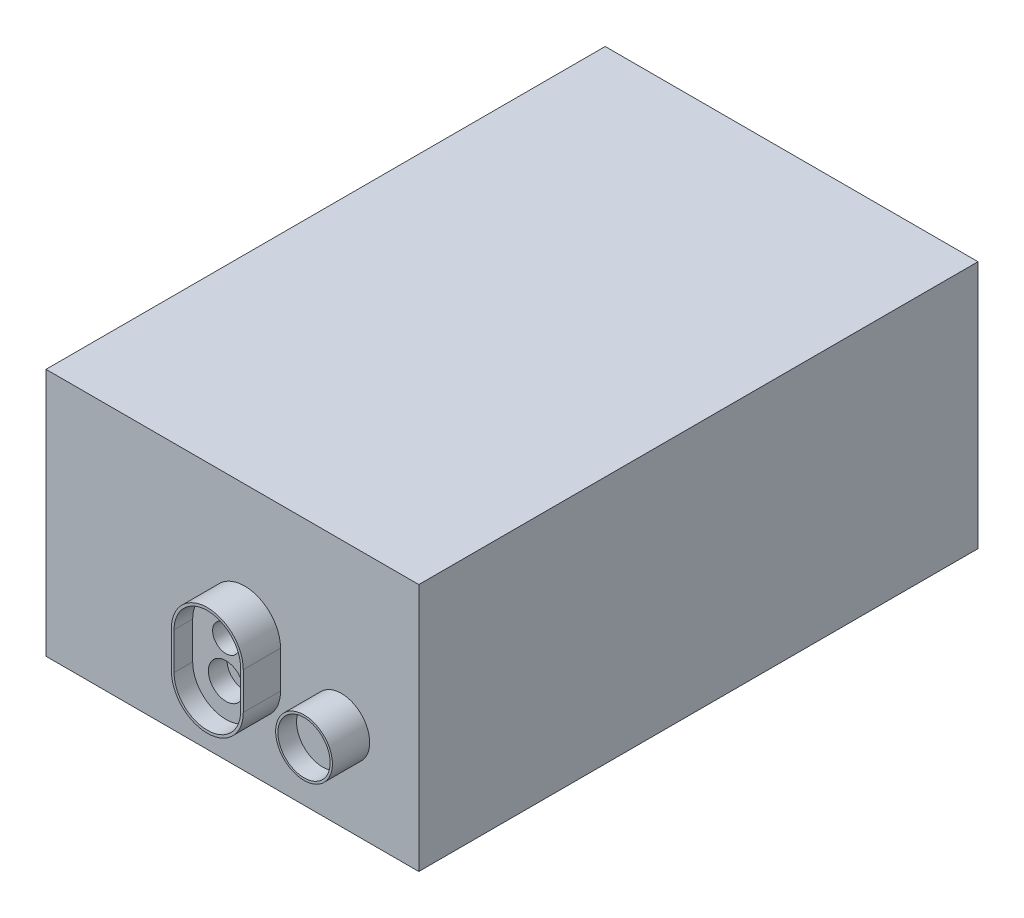
ISO-10303-21;
HEADER;
FILE_DESCRIPTION(('STEP AP214'),'2;1');
FILE_NAME('part.step','',(''),(''),'','','');
FILE_SCHEMA(('AUTOMOTIVE_DESIGN { 1 0 10303 214 1 1 1 1 }'));
ENDSEC;
DATA;
#1=APPLICATION_CONTEXT('core data for automotive mechanical design processes');
#2=APPLICATION_PROTOCOL_DEFINITION('international standard','automotive_design',2000,#1);
#3=PRODUCT_CONTEXT('',#1,'mechanical');
#4=PRODUCT('Part','Part','',(#3));
#5=PRODUCT_RELATED_PRODUCT_CATEGORY('part','',(#4));
#6=PRODUCT_DEFINITION_FORMATION('','',#4);
#7=PRODUCT_DEFINITION_CONTEXT('part definition',#1,'design');
#8=PRODUCT_DEFINITION('design','',#6,#7);
#9=PRODUCT_DEFINITION_SHAPE('','',#8);
#10=(LENGTH_UNIT() NAMED_UNIT(*) SI_UNIT(.MILLI.,.METRE.));
#11=(NAMED_UNIT(*) PLANE_ANGLE_UNIT() SI_UNIT($,.RADIAN.));
#12=(NAMED_UNIT(*) SI_UNIT($,.STERADIAN.) SOLID_ANGLE_UNIT());
#13=UNCERTAINTY_MEASURE_WITH_UNIT(LENGTH_MEASURE(1.E-05),#10,'distance_accuracy_value','');
#14=(GEOMETRIC_REPRESENTATION_CONTEXT(3) GLOBAL_UNCERTAINTY_ASSIGNED_CONTEXT((#13)) GLOBAL_UNIT_ASSIGNED_CONTEXT((#10,
#11,#12)) REPRESENTATION_CONTEXT('',''));
#15=CARTESIAN_POINT('',(0.,0.,0.));
#16=DIRECTION('',(0.,0.,1.));
#17=DIRECTION('',(1.,0.,0.));
#18=AXIS2_PLACEMENT_3D('',#15,#16,#17);
#19=CARTESIAN_POINT('',(0.,0.,450.));
#20=DIRECTION('',(0.,0.,1.));
#21=DIRECTION('',(1.,0.,0.));
#22=AXIS2_PLACEMENT_3D('',#19,#20,#21);
#23=PLANE('',#22);
#24=CARTESIAN_POINT('',(87.6401102736888,-29.8283884089379,450.));
#25=DIRECTION('',(0.,0.,1.));
#26=DIRECTION('',(1.,0.,0.));
#27=AXIS2_PLACEMENT_3D('',#24,#25,#26);
#28=CIRCLE('',#27,22.8489858599226);
#29=CARTESIAN_POINT('',(110.489096133611,-29.8283884089379,450.));
#30=VERTEX_POINT('',#29);
#31=EDGE_CURVE('E187',#30,#30,#28,.T.);
#32=ORIENTED_EDGE('',*,*,#31,.F.);
#33=EDGE_LOOP('',(#32));
#34=FACE_BOUND('',#33,.T.);
#35=DIRECTION('',(0.,1.,0.));
#36=VECTOR('',#35,1.);
#37=CARTESIAN_POINT('',(150.,100.,450.));
#38=LINE('',#37,#36);
#39=CARTESIAN_POINT('',(150.,-100.,450.));
#40=VERTEX_POINT('',#39);
#41=CARTESIAN_POINT('',(150.,100.,450.));
#42=VERTEX_POINT('',#41);
#43=EDGE_CURVE('E260',#40,#42,#38,.T.);
#44=ORIENTED_EDGE('',*,*,#43,.T.);
#45=DIRECTION('',(-1.,0.,0.));
#46=VECTOR('',#45,1.);
#47=CARTESIAN_POINT('',(-150.,100.,450.));
#48=LINE('',#47,#46);
#49=CARTESIAN_POINT('',(-150.,100.,450.));
#50=VERTEX_POINT('',#49);
#51=EDGE_CURVE('E264',#42,#50,#48,.T.);
#52=ORIENTED_EDGE('',*,*,#51,.T.);
#53=DIRECTION('',(0.,-1.,0.));
#54=VECTOR('',#53,1.);
#55=CARTESIAN_POINT('',(-150.,100.,450.));
#56=LINE('',#55,#54);
#57=CARTESIAN_POINT('',(-150.,-100.,450.));
#58=VERTEX_POINT('',#57);
#59=EDGE_CURVE('E268',#50,#58,#56,.T.);
#60=ORIENTED_EDGE('',*,*,#59,.T.);
#61=DIRECTION('',(1.,0.,0.));
#62=VECTOR('',#61,1.);
#63=CARTESIAN_POINT('',(-150.,-100.,450.));
#64=LINE('',#63,#62);
#65=EDGE_CURVE('E271',#58,#40,#64,.T.);
#66=ORIENTED_EDGE('',*,*,#65,.T.);
#67=EDGE_LOOP('',(#44,#52,#60,#66));
#68=FACE_BOUND('',#67,.T.);
#69=DIRECTION('',(0.,-1.,0.));
#70=VECTOR('',#69,1.);
#71=CARTESIAN_POINT('',(-19.0655678490148,0.,450.));
#72=LINE('',#71,#70);
#73=CARTESIAN_POINT('',(-19.0655678490148,0.,450.));
#74=VERTEX_POINT('',#73);
#75=CARTESIAN_POINT('',(-19.0655678490148,-29.8283884089379,450.));
#76=VERTEX_POINT('',#75);
#77=EDGE_CURVE('E237',#74,#76,#72,.T.);
#78=ORIENTED_EDGE('',*,*,#77,.F.);
#79=CARTESIAN_POINT('',(9.84029308336154,0.,450.));
#80=DIRECTION('',(0.,0.,1.));
#81=DIRECTION('',(1.,0.,0.));
#82=AXIS2_PLACEMENT_3D('',#79,#80,#81);
#83=CIRCLE('',#82,28.9058609323763);
#84=CARTESIAN_POINT('',(38.7461540157379,0.,450.));
#85=VERTEX_POINT('',#84);
#86=EDGE_CURVE('E218',#85,#74,#83,.T.);
#87=ORIENTED_EDGE('',*,*,#86,.F.);
#88=DIRECTION('',(0.,1.,0.));
#89=VECTOR('',#88,1.);
#90=CARTESIAN_POINT('',(38.7461540157379,0.,450.));
#91=LINE('',#90,#89);
#92=CARTESIAN_POINT('',(38.7461540157379,-29.8283884089379,450.));
#93=VERTEX_POINT('',#92);
#94=EDGE_CURVE('E224',#93,#85,#91,.T.);
#95=ORIENTED_EDGE('',*,*,#94,.F.);
#96=CARTESIAN_POINT('',(9.84029308336154,-29.8283884089379,450.));
#97=DIRECTION('',(0.,0.,1.));
#98=DIRECTION('',(1.,0.,0.));
#99=AXIS2_PLACEMENT_3D('',#96,#97,#98);
#100=CIRCLE('',#99,28.9058609323763);
#101=EDGE_CURVE('E240',#76,#93,#100,.T.);
#102=ORIENTED_EDGE('',*,*,#101,.F.);
#103=EDGE_LOOP('',(#78,#87,#95,#102));
#104=FACE_BOUND('',#103,.T.);
#105=ADVANCED_FACE('F42',(#34,#68,#104),#23,.T.);
#106=CARTESIAN_POINT('',(150.,100.,450.));
#107=DIRECTION('',(-1.,0.,0.));
#108=DIRECTION('',(0.,0.,1.));
#109=AXIS2_PLACEMENT_3D('',#106,#107,#108);
#110=PLANE('',#109);
#111=DIRECTION('',(0.,1.,0.));
#112=VECTOR('',#111,1.);
#113=CARTESIAN_POINT('',(150.,100.,0.));
#114=LINE('',#113,#112);
#115=CARTESIAN_POINT('',(150.,-100.,0.));
#116=VERTEX_POINT('',#115);
#117=CARTESIAN_POINT('',(150.,100.,0.));
#118=VERTEX_POINT('',#117);
#119=EDGE_CURVE('E259',#116,#118,#114,.T.);
#120=ORIENTED_EDGE('',*,*,#119,.T.);
#121=DIRECTION('',(0.,0.,-1.));
#122=VECTOR('',#121,1.);
#123=CARTESIAN_POINT('',(150.,100.,450.));
#124=LINE('',#123,#122);
#125=EDGE_CURVE('E297',#42,#118,#124,.T.);
#126=ORIENTED_EDGE('',*,*,#125,.F.);
#127=ORIENTED_EDGE('',*,*,#43,.F.);
#128=DIRECTION('',(0.,0.,-1.));
#129=VECTOR('',#128,1.);
#130=CARTESIAN_POINT('',(150.,-100.,450.));
#131=LINE('',#130,#129);
#132=EDGE_CURVE('E274',#40,#116,#131,.T.);
#133=ORIENTED_EDGE('',*,*,#132,.T.);
#134=EDGE_LOOP('',(#120,#126,#127,#133));
#135=FACE_BOUND('',#134,.T.);
#136=ADVANCED_FACE('F368',(#135),#110,.F.);
#137=CARTESIAN_POINT('',(-150.,100.,450.));
#138=DIRECTION('',(0.,-1.,0.));
#139=DIRECTION('',(0.,0.,-1.));
#140=AXIS2_PLACEMENT_3D('',#137,#138,#139);
#141=PLANE('',#140);
#142=DIRECTION('',(-1.,0.,0.));
#143=VECTOR('',#142,1.);
#144=CARTESIAN_POINT('',(-150.,100.,0.));
#145=LINE('',#144,#143);
#146=CARTESIAN_POINT('',(-150.,100.,0.));
#147=VERTEX_POINT('',#146);
#148=EDGE_CURVE('E278',#118,#147,#145,.T.);
#149=ORIENTED_EDGE('',*,*,#148,.T.);
#150=DIRECTION('',(0.,0.,-1.));
#151=VECTOR('',#150,1.);
#152=CARTESIAN_POINT('',(-150.,100.,450.));
#153=LINE('',#152,#151);
#154=EDGE_CURVE('E293',#50,#147,#153,.T.);
#155=ORIENTED_EDGE('',*,*,#154,.F.);
#156=ORIENTED_EDGE('',*,*,#51,.F.);
#157=ORIENTED_EDGE('',*,*,#125,.T.);
#158=EDGE_LOOP('',(#149,#155,#156,#157));
#159=FACE_BOUND('',#158,.T.);
#160=ADVANCED_FACE('F373',(#159),#141,.F.);
#161=CARTESIAN_POINT('',(-150.,100.,450.));
#162=DIRECTION('',(1.,0.,0.));
#163=DIRECTION('',(0.,1.,0.));
#164=AXIS2_PLACEMENT_3D('',#161,#162,#163);
#165=PLANE('',#164);
#166=DIRECTION('',(0.,-1.,0.));
#167=VECTOR('',#166,1.);
#168=CARTESIAN_POINT('',(-150.,100.,0.));
#169=LINE('',#168,#167);
#170=CARTESIAN_POINT('',(-150.,-100.,0.));
#171=VERTEX_POINT('',#170);
#172=EDGE_CURVE('E281',#147,#171,#169,.T.);
#173=ORIENTED_EDGE('',*,*,#172,.T.);
#174=DIRECTION('',(0.,0.,-1.));
#175=VECTOR('',#174,1.);
#176=CARTESIAN_POINT('',(-150.,-100.,450.));
#177=LINE('',#176,#175);
#178=EDGE_CURVE('E289',#58,#171,#177,.T.);
#179=ORIENTED_EDGE('',*,*,#178,.F.);
#180=ORIENTED_EDGE('',*,*,#59,.F.);
#181=ORIENTED_EDGE('',*,*,#154,.T.);
#182=EDGE_LOOP('',(#173,#179,#180,#181));
#183=FACE_BOUND('',#182,.T.);
#184=ADVANCED_FACE('F428',(#183),#165,.F.);
#185=CARTESIAN_POINT('',(-150.,-100.,450.));
#186=DIRECTION('',(0.,1.,0.));
#187=DIRECTION('',(0.,0.,1.));
#188=AXIS2_PLACEMENT_3D('',#185,#186,#187);
#189=PLANE('',#188);
#190=DIRECTION('',(1.,0.,0.));
#191=VECTOR('',#190,1.);
#192=CARTESIAN_POINT('',(-150.,-100.,0.));
#193=LINE('',#192,#191);
#194=EDGE_CURVE('E265',#171,#116,#193,.T.);
#195=ORIENTED_EDGE('',*,*,#194,.T.);
#196=ORIENTED_EDGE('',*,*,#132,.F.);
#197=ORIENTED_EDGE('',*,*,#65,.F.);
#198=ORIENTED_EDGE('',*,*,#178,.T.);
#199=EDGE_LOOP('',(#195,#196,#197,#198));
#200=FACE_BOUND('',#199,.T.);
#201=ADVANCED_FACE('F423',(#200),#189,.F.);
#202=CARTESIAN_POINT('',(0.,0.,0.));
#203=DIRECTION('',(0.,0.,1.));
#204=DIRECTION('',(1.,0.,0.));
#205=AXIS2_PLACEMENT_3D('',#202,#203,#204);
#206=PLANE('',#205);
#207=ORIENTED_EDGE('',*,*,#119,.F.);
#208=ORIENTED_EDGE('',*,*,#194,.F.);
#209=ORIENTED_EDGE('',*,*,#172,.F.);
#210=ORIENTED_EDGE('',*,*,#148,.F.);
#211=EDGE_LOOP('',(#207,#208,#209,#210));
#212=FACE_BOUND('',#211,.T.);
#213=ADVANCED_FACE('F419',(#212),#206,.F.);
#214=CARTESIAN_POINT('',(9.84029308336154,0.,480.));
#215=DIRECTION('',(0.,0.,1.));
#216=DIRECTION('',(1.,0.,0.));
#217=AXIS2_PLACEMENT_3D('',#214,#215,#216);
#218=PLANE('',#217);
#219=CARTESIAN_POINT('',(9.84029308336154,0.,480.));
#220=DIRECTION('',(0.,0.,1.));
#221=DIRECTION('',(1.,0.,0.));
#222=AXIS2_PLACEMENT_3D('',#219,#220,#221);
#223=CIRCLE('',#222,28.9058609323763);
#224=CARTESIAN_POINT('',(38.7461540157379,0.,480.));
#225=VERTEX_POINT('',#224);
#226=CARTESIAN_POINT('',(-19.0655678490148,0.,480.));
#227=VERTEX_POINT('',#226);
#228=EDGE_CURVE('E219',#225,#227,#223,.T.);
#229=ORIENTED_EDGE('',*,*,#228,.T.);
#230=DIRECTION('',(0.,-1.,0.));
#231=VECTOR('',#230,1.);
#232=CARTESIAN_POINT('',(-19.0655678490148,0.,480.));
#233=LINE('',#232,#231);
#234=CARTESIAN_POINT('',(-19.0655678490148,-29.8283884089379,480.));
#235=VERTEX_POINT('',#234);
#236=EDGE_CURVE('E223',#227,#235,#233,.T.);
#237=ORIENTED_EDGE('',*,*,#236,.T.);
#238=CARTESIAN_POINT('',(9.84029308336154,-29.8283884089379,480.));
#239=DIRECTION('',(0.,0.,1.));
#240=DIRECTION('',(1.,0.,0.));
#241=AXIS2_PLACEMENT_3D('',#238,#239,#240);
#242=CIRCLE('',#241,28.9058609323763);
#243=CARTESIAN_POINT('',(38.7461540157379,-29.8283884089379,480.));
#244=VERTEX_POINT('',#243);
#245=EDGE_CURVE('E227',#235,#244,#242,.T.);
#246=ORIENTED_EDGE('',*,*,#245,.T.);
#247=DIRECTION('',(0.,1.,0.));
#248=VECTOR('',#247,1.);
#249=CARTESIAN_POINT('',(38.7461540157379,0.,480.));
#250=LINE('',#249,#248);
#251=EDGE_CURVE('E230',#244,#225,#250,.T.);
#252=ORIENTED_EDGE('',*,*,#251,.T.);
#253=EDGE_LOOP('',(#229,#237,#246,#252));
#254=FACE_BOUND('',#253,.T.);
#255=DIRECTION('',(0.,-1.,0.));
#256=VECTOR('',#255,1.);
#257=CARTESIAN_POINT('',(-16.9640698543901,0.,480.));
#258=LINE('',#257,#256);
#259=CARTESIAN_POINT('',(-16.9640698543901,0.,480.));
#260=VERTEX_POINT('',#259);
#261=CARTESIAN_POINT('',(-16.9640698543901,-29.8283884089379,480.));
#262=VERTEX_POINT('',#261);
#263=EDGE_CURVE('E202',#260,#262,#258,.T.);
#264=ORIENTED_EDGE('',*,*,#263,.F.);
#265=CARTESIAN_POINT('',(9.84029308336154,0.,480.));
#266=DIRECTION('',(0.,0.,1.));
#267=DIRECTION('',(1.,0.,0.));
#268=AXIS2_PLACEMENT_3D('',#265,#266,#267);
#269=CIRCLE('',#268,26.8043629377517);
#270=CARTESIAN_POINT('',(36.6446560211132,0.,480.));
#271=VERTEX_POINT('',#270);
#272=EDGE_CURVE('E196',#271,#260,#269,.T.);
#273=ORIENTED_EDGE('',*,*,#272,.F.);
#274=DIRECTION('',(0.,1.,0.));
#275=VECTOR('',#274,1.);
#276=CARTESIAN_POINT('',(36.6446560211132,0.,480.));
#277=LINE('',#276,#275);
#278=CARTESIAN_POINT('',(36.6446560211132,-29.8283884089379,480.));
#279=VERTEX_POINT('',#278);
#280=EDGE_CURVE('E165',#279,#271,#277,.T.);
#281=ORIENTED_EDGE('',*,*,#280,.F.);
#282=CARTESIAN_POINT('',(9.84029308336154,-29.8283884089379,480.));
#283=DIRECTION('',(0.,0.,1.));
#284=DIRECTION('',(1.,0.,0.));
#285=AXIS2_PLACEMENT_3D('',#282,#283,#284);
#286=CIRCLE('',#285,26.8043629377517);
#287=EDGE_CURVE('E205',#262,#279,#286,.T.);
#288=ORIENTED_EDGE('',*,*,#287,.F.);
#289=EDGE_LOOP('',(#264,#273,#281,#288));
#290=FACE_BOUND('',#289,.T.);
#291=ADVANCED_FACE('F395',(#254,#290),#218,.T.);
#292=CARTESIAN_POINT('',(9.84029308336154,0.,480.));
#293=DIRECTION('',(0.,0.,-1.));
#294=DIRECTION('',(-1.,0.,0.));
#295=AXIS2_PLACEMENT_3D('',#292,#293,#294);
#296=CYLINDRICAL_SURFACE('',#295,28.9058609323763);
#297=ORIENTED_EDGE('',*,*,#86,.T.);
#298=DIRECTION('',(0.,0.,-1.));
#299=VECTOR('',#298,1.);
#300=CARTESIAN_POINT('',(-19.0655678490148,0.,480.));
#301=LINE('',#300,#299);
#302=EDGE_CURVE('E256',#227,#74,#301,.T.);
#303=ORIENTED_EDGE('',*,*,#302,.F.);
#304=ORIENTED_EDGE('',*,*,#228,.F.);
#305=DIRECTION('',(0.,0.,-1.));
#306=VECTOR('',#305,1.);
#307=CARTESIAN_POINT('',(38.7461540157379,0.,480.));
#308=LINE('',#307,#306);
#309=EDGE_CURVE('E233',#225,#85,#308,.T.);
#310=ORIENTED_EDGE('',*,*,#309,.T.);
#311=EDGE_LOOP('',(#297,#303,#304,#310));
#312=FACE_BOUND('',#311,.T.);
#313=ADVANCED_FACE('F400',(#312),#296,.T.);
#314=CARTESIAN_POINT('',(-19.0655678490148,0.,480.));
#315=DIRECTION('',(1.,0.,0.));
#316=DIRECTION('',(0.,0.,-1.));
#317=AXIS2_PLACEMENT_3D('',#314,#315,#316);
#318=PLANE('',#317);
#319=ORIENTED_EDGE('',*,*,#77,.T.);
#320=DIRECTION('',(0.,0.,-1.));
#321=VECTOR('',#320,1.);
#322=CARTESIAN_POINT('',(-19.0655678490148,-29.8283884089379,480.));
#323=LINE('',#322,#321);
#324=EDGE_CURVE('E252',#235,#76,#323,.T.);
#325=ORIENTED_EDGE('',*,*,#324,.F.);
#326=ORIENTED_EDGE('',*,*,#236,.F.);
#327=ORIENTED_EDGE('',*,*,#302,.T.);
#328=EDGE_LOOP('',(#319,#325,#326,#327));
#329=FACE_BOUND('',#328,.T.);
#330=ADVANCED_FACE('F387',(#329),#318,.F.);
#331=CARTESIAN_POINT('',(9.84029308336154,-29.8283884089379,480.));
#332=DIRECTION('',(0.,0.,-1.));
#333=DIRECTION('',(-1.,0.,0.));
#334=AXIS2_PLACEMENT_3D('',#331,#332,#333);
#335=CYLINDRICAL_SURFACE('',#334,28.9058609323763);
#336=ORIENTED_EDGE('',*,*,#101,.T.);
#337=DIRECTION('',(0.,0.,-1.));
#338=VECTOR('',#337,1.);
#339=CARTESIAN_POINT('',(38.7461540157379,-29.8283884089379,480.));
#340=LINE('',#339,#338);
#341=EDGE_CURVE('E249',#244,#93,#340,.T.);
#342=ORIENTED_EDGE('',*,*,#341,.F.);
#343=ORIENTED_EDGE('',*,*,#245,.F.);
#344=ORIENTED_EDGE('',*,*,#324,.T.);
#345=EDGE_LOOP('',(#336,#342,#343,#344));
#346=FACE_BOUND('',#345,.T.);
#347=ADVANCED_FACE('F391',(#346),#335,.T.);
#348=CARTESIAN_POINT('',(38.7461540157379,0.,480.));
#349=DIRECTION('',(-1.,0.,0.));
#350=DIRECTION('',(0.,0.,1.));
#351=AXIS2_PLACEMENT_3D('',#348,#349,#350);
#352=PLANE('',#351);
#353=ORIENTED_EDGE('',*,*,#94,.T.);
#354=ORIENTED_EDGE('',*,*,#309,.F.);
#355=ORIENTED_EDGE('',*,*,#251,.F.);
#356=ORIENTED_EDGE('',*,*,#341,.T.);
#357=EDGE_LOOP('',(#353,#354,#355,#356));
#358=FACE_BOUND('',#357,.T.);
#359=ADVANCED_FACE('F402',(#358),#352,.F.);
#360=CARTESIAN_POINT('',(9.84029308336154,0.,480.));
#361=DIRECTION('',(0.,0.,-1.));
#362=DIRECTION('',(-1.,0.,0.));
#363=AXIS2_PLACEMENT_3D('',#360,#361,#362);
#364=CYLINDRICAL_SURFACE('',#363,26.8043629377517);
#365=CARTESIAN_POINT('',(9.84029308336154,0.,465.));
#366=DIRECTION('',(0.,0.,1.));
#367=DIRECTION('',(1.,0.,0.));
#368=AXIS2_PLACEMENT_3D('',#365,#366,#367);
#369=CIRCLE('',#368,26.8043629377517);
#370=CARTESIAN_POINT('',(36.6446560211132,0.,465.));
#371=VERTEX_POINT('',#370);
#372=CARTESIAN_POINT('',(-16.9640698543901,0.,465.));
#373=VERTEX_POINT('',#372);
#374=EDGE_CURVE('E172',#371,#373,#369,.T.);
#375=ORIENTED_EDGE('',*,*,#374,.F.);
#376=DIRECTION('',(0.,0.,-1.));
#377=VECTOR('',#376,1.);
#378=CARTESIAN_POINT('',(36.6446560211132,0.,480.));
#379=LINE('',#378,#377);
#380=EDGE_CURVE('E159',#271,#371,#379,.T.);
#381=ORIENTED_EDGE('',*,*,#380,.F.);
#382=ORIENTED_EDGE('',*,*,#272,.T.);
#383=DIRECTION('',(0.,0.,-1.));
#384=VECTOR('',#383,1.);
#385=CARTESIAN_POINT('',(-16.9640698543901,0.,480.));
#386=LINE('',#385,#384);
#387=EDGE_CURVE('E174',#260,#373,#386,.T.);
#388=ORIENTED_EDGE('',*,*,#387,.T.);
#389=EDGE_LOOP('',(#375,#381,#382,#388));
#390=FACE_BOUND('',#389,.T.);
#391=ADVANCED_FACE('F173',(#390),#364,.F.);
#392=CARTESIAN_POINT('',(-16.9640698543901,0.,480.));
#393=DIRECTION('',(1.,0.,0.));
#394=DIRECTION('',(0.,0.,-1.));
#395=AXIS2_PLACEMENT_3D('',#392,#393,#394);
#396=PLANE('',#395);
#397=DIRECTION('',(0.,-1.,0.));
#398=VECTOR('',#397,1.);
#399=CARTESIAN_POINT('',(-16.9640698543901,0.,465.));
#400=LINE('',#399,#398);
#401=CARTESIAN_POINT('',(-16.9640698543901,-29.8283884089379,465.));
#402=VERTEX_POINT('',#401);
#403=EDGE_CURVE('E59',#373,#402,#400,.T.);
#404=ORIENTED_EDGE('',*,*,#403,.F.);
#405=ORIENTED_EDGE('',*,*,#387,.F.);
#406=ORIENTED_EDGE('',*,*,#263,.T.);
#407=DIRECTION('',(0.,0.,-1.));
#408=VECTOR('',#407,1.);
#409=CARTESIAN_POINT('',(-16.9640698543901,-29.8283884089379,480.));
#410=LINE('',#409,#408);
#411=EDGE_CURVE('E213',#262,#402,#410,.T.);
#412=ORIENTED_EDGE('',*,*,#411,.T.);
#413=EDGE_LOOP('',(#404,#405,#406,#412));
#414=FACE_BOUND('',#413,.T.);
#415=ADVANCED_FACE('F409',(#414),#396,.T.);
#416=CARTESIAN_POINT('',(9.84029308336154,-29.8283884089379,480.));
#417=DIRECTION('',(0.,0.,-1.));
#418=DIRECTION('',(-1.,0.,0.));
#419=AXIS2_PLACEMENT_3D('',#416,#417,#418);
#420=CYLINDRICAL_SURFACE('',#419,26.8043629377517);
#421=CARTESIAN_POINT('',(9.84029308336154,-29.8283884089379,465.));
#422=DIRECTION('',(0.,0.,1.));
#423=DIRECTION('',(1.,0.,0.));
#424=AXIS2_PLACEMENT_3D('',#421,#422,#423);
#425=CIRCLE('',#424,26.8043629377517);
#426=CARTESIAN_POINT('',(36.6446560211132,-29.8283884089379,465.));
#427=VERTEX_POINT('',#426);
#428=EDGE_CURVE('E67',#402,#427,#425,.T.);
#429=ORIENTED_EDGE('',*,*,#428,.F.);
#430=ORIENTED_EDGE('',*,*,#411,.F.);
#431=ORIENTED_EDGE('',*,*,#287,.T.);
#432=DIRECTION('',(0.,0.,-1.));
#433=VECTOR('',#432,1.);
#434=CARTESIAN_POINT('',(36.6446560211132,-29.8283884089379,480.));
#435=LINE('',#434,#433);
#436=EDGE_CURVE('E169',#279,#427,#435,.T.);
#437=ORIENTED_EDGE('',*,*,#436,.T.);
#438=EDGE_LOOP('',(#429,#430,#431,#437));
#439=FACE_BOUND('',#438,.T.);
#440=ADVANCED_FACE('F552',(#439),#420,.F.);
#441=CARTESIAN_POINT('',(36.6446560211132,0.,480.));
#442=DIRECTION('',(-1.,0.,0.));
#443=DIRECTION('',(0.,0.,1.));
#444=AXIS2_PLACEMENT_3D('',#441,#442,#443);
#445=PLANE('',#444);
#446=DIRECTION('',(0.,1.,0.));
#447=VECTOR('',#446,1.);
#448=CARTESIAN_POINT('',(36.6446560211132,-29.8283884089379,465.));
#449=LINE('',#448,#447);
#450=EDGE_CURVE('E163',#427,#371,#449,.T.);
#451=ORIENTED_EDGE('',*,*,#450,.F.);
#452=ORIENTED_EDGE('',*,*,#436,.F.);
#453=ORIENTED_EDGE('',*,*,#280,.T.);
#454=ORIENTED_EDGE('',*,*,#380,.T.);
#455=EDGE_LOOP('',(#451,#452,#453,#454));
#456=FACE_BOUND('',#455,.T.);
#457=ADVANCED_FACE('F161',(#456),#445,.T.);
#458=CARTESIAN_POINT('',(87.6401102736888,-29.8283884089379,480.));
#459=DIRECTION('',(0.,0.,1.));
#460=DIRECTION('',(1.,0.,0.));
#461=AXIS2_PLACEMENT_3D('',#458,#459,#460);
#462=PLANE('',#461);
#463=CARTESIAN_POINT('',(87.6401102736888,-29.8283884089379,480.));
#464=DIRECTION('',(0.,0.,1.));
#465=DIRECTION('',(1.,0.,0.));
#466=AXIS2_PLACEMENT_3D('',#463,#464,#465);
#467=CIRCLE('',#466,22.8489858599226);
#468=CARTESIAN_POINT('',(110.489096133611,-29.8283884089379,480.));
#469=VERTEX_POINT('',#468);
#470=EDGE_CURVE('E192',#469,#469,#467,.T.);
#471=ORIENTED_EDGE('',*,*,#470,.T.);
#472=EDGE_LOOP('',(#471));
#473=FACE_BOUND('',#472,.T.);
#474=CARTESIAN_POINT('',(87.6401102736888,-29.8283884089379,480.));
#475=DIRECTION('',(0.,0.,1.));
#476=DIRECTION('',(1.,0.,0.));
#477=AXIS2_PLACEMENT_3D('',#474,#475,#476);
#478=CIRCLE('',#477,21.0394036670136);
#479=CARTESIAN_POINT('',(108.679513940702,-29.8283884089379,480.));
#480=VERTEX_POINT('',#479);
#481=EDGE_CURVE('E182',#480,#480,#478,.T.);
#482=ORIENTED_EDGE('',*,*,#481,.F.);
#483=EDGE_LOOP('',(#482));
#484=FACE_BOUND('',#483,.T.);
#485=ADVANCED_FACE('F518',(#473,#484),#462,.T.);
#486=CARTESIAN_POINT('',(87.6401102736888,-29.8283884089379,480.));
#487=DIRECTION('',(0.,0.,-1.));
#488=DIRECTION('',(-1.,0.,0.));
#489=AXIS2_PLACEMENT_3D('',#486,#487,#488);
#490=CYLINDRICAL_SURFACE('',#489,22.8489858599226);
#491=ORIENTED_EDGE('',*,*,#470,.F.);
#492=EDGE_LOOP('',(#491));
#493=FACE_BOUND('',#492,.T.);
#494=ORIENTED_EDGE('',*,*,#31,.T.);
#495=EDGE_LOOP('',(#494));
#496=FACE_BOUND('',#495,.T.);
#497=ADVANCED_FACE('F523',(#493,#496),#490,.T.);
#498=CARTESIAN_POINT('',(87.6401102736888,-29.8283884089379,480.));
#499=DIRECTION('',(0.,0.,-1.));
#500=DIRECTION('',(-1.,0.,0.));
#501=AXIS2_PLACEMENT_3D('',#498,#499,#500);
#502=CYLINDRICAL_SURFACE('',#501,21.0394036670136);
#503=CARTESIAN_POINT('',(87.6401102736888,-29.8283884089379,465.));
#504=DIRECTION('',(0.,0.,1.));
#505=DIRECTION('',(1.,0.,0.));
#506=AXIS2_PLACEMENT_3D('',#503,#504,#505);
#507=CIRCLE('',#506,21.0394036670136);
#508=CARTESIAN_POINT('',(108.679513940702,-29.8283884089379,465.));
#509=VERTEX_POINT('',#508);
#510=EDGE_CURVE('E11',#509,#509,#507,.T.);
#511=ORIENTED_EDGE('',*,*,#510,.F.);
#512=EDGE_LOOP('',(#511));
#513=FACE_BOUND('',#512,.T.);
#514=ORIENTED_EDGE('',*,*,#481,.T.);
#515=EDGE_LOOP('',(#514));
#516=FACE_BOUND('',#515,.T.);
#517=ADVANCED_FACE('F535',(#513,#516),#502,.F.);
#518=CARTESIAN_POINT('',(9.84029308336154,0.,465.));
#519=DIRECTION('',(0.,0.,1.));
#520=DIRECTION('',(1.,0.,0.));
#521=AXIS2_PLACEMENT_3D('',#518,#519,#520);
#522=PLANE('',#521);
#523=CARTESIAN_POINT('',(9.84029308336154,0.,465.));
#524=DIRECTION('',(0.,0.,1.));
#525=DIRECTION('',(1.,0.,0.));
#526=AXIS2_PLACEMENT_3D('',#523,#524,#525);
#527=CIRCLE('',#526,10.7628205599267);
#528=CARTESIAN_POINT('',(20.6031136432882,0.,465.));
#529=VERTEX_POINT('',#528);
#530=EDGE_CURVE('E177',#529,#529,#527,.T.);
#531=ORIENTED_EDGE('',*,*,#530,.F.);
#532=EDGE_LOOP('',(#531));
#533=FACE_BOUND('',#532,.T.);
#534=ORIENTED_EDGE('',*,*,#374,.T.);
#535=ORIENTED_EDGE('',*,*,#403,.T.);
#536=ORIENTED_EDGE('',*,*,#428,.T.);
#537=ORIENTED_EDGE('',*,*,#450,.T.);
#538=EDGE_LOOP('',(#534,#535,#536,#537));
#539=FACE_BOUND('',#538,.T.);
#540=CARTESIAN_POINT('',(9.84029308336154,-29.8283884089379,465.));
#541=DIRECTION('',(0.,0.,1.));
#542=DIRECTION('',(1.,0.,0.));
#543=AXIS2_PLACEMENT_3D('',#540,#541,#542);
#544=CIRCLE('',#543,14.1754718054443);
#545=CARTESIAN_POINT('',(24.0157648888058,-29.8283884089379,465.));
#546=VERTEX_POINT('',#545);
#547=EDGE_CURVE('E692',#546,#546,#544,.T.);
#548=ORIENTED_EDGE('',*,*,#547,.F.);
#549=EDGE_LOOP('',(#548));
#550=FACE_BOUND('',#549,.T.);
#551=ADVANCED_FACE('F179',(#533,#539,#550),#522,.T.);
#552=CARTESIAN_POINT('',(9.84029308336154,0.,465.));
#553=DIRECTION('',(0.,0.,-1.));
#554=DIRECTION('',(-1.,0.,0.));
#555=AXIS2_PLACEMENT_3D('',#552,#553,#554);
#556=CYLINDRICAL_SURFACE('',#555,10.7628205599267);
#557=ORIENTED_EDGE('',*,*,#530,.T.);
#558=EDGE_LOOP('',(#557));
#559=FACE_BOUND('',#558,.T.);
#560=CARTESIAN_POINT('',(9.84029308336154,0.,450.));
#561=DIRECTION('',(0.,0.,1.));
#562=DIRECTION('',(1.,0.,0.));
#563=AXIS2_PLACEMENT_3D('',#560,#561,#562);
#564=CIRCLE('',#563,10.7628205599267);
#565=CARTESIAN_POINT('',(20.6031136432882,0.,450.));
#566=VERTEX_POINT('',#565);
#567=EDGE_CURVE('E52',#566,#566,#564,.F.);
#568=ORIENTED_EDGE('',*,*,#567,.T.);
#569=EDGE_LOOP('',(#568));
#570=FACE_BOUND('',#569,.T.);
#571=ADVANCED_FACE('F350',(#559,#570),#556,.F.);
#572=CARTESIAN_POINT('',(9.84029308336154,-29.8283884089379,465.));
#573=DIRECTION('',(0.,0.,-1.));
#574=DIRECTION('',(-1.,0.,0.));
#575=AXIS2_PLACEMENT_3D('',#572,#573,#574);
#576=CYLINDRICAL_SURFACE('',#575,14.1754718054443);
#577=ORIENTED_EDGE('',*,*,#547,.T.);
#578=EDGE_LOOP('',(#577));
#579=FACE_BOUND('',#578,.T.);
#580=CARTESIAN_POINT('',(9.84029308336154,-29.8283884089379,450.));
#581=DIRECTION('',(0.,0.,1.));
#582=DIRECTION('',(1.,0.,0.));
#583=AXIS2_PLACEMENT_3D('',#580,#581,#582);
#584=CIRCLE('',#583,14.1754718054443);
#585=CARTESIAN_POINT('',(24.0157648888058,-29.8283884089379,450.));
#586=VERTEX_POINT('',#585);
#587=EDGE_CURVE('E305',#586,#586,#584,.F.);
#588=ORIENTED_EDGE('',*,*,#587,.T.);
#589=EDGE_LOOP('',(#588));
#590=FACE_BOUND('',#589,.T.);
#591=ADVANCED_FACE('F363',(#579,#590),#576,.F.);
#592=ORIENTED_EDGE('',*,*,#587,.F.);
#593=EDGE_LOOP('',(#592));
#594=FACE_BOUND('',#593,.T.);
#595=ADVANCED_FACE('F355',(#594),#23,.T.);
#596=ORIENTED_EDGE('',*,*,#567,.F.);
#597=EDGE_LOOP('',(#596));
#598=FACE_BOUND('',#597,.T.);
#599=ADVANCED_FACE('F352',(#598),#23,.T.);
#600=CARTESIAN_POINT('',(87.6401102736888,-29.8283884089379,465.));
#601=DIRECTION('',(0.,0.,1.));
#602=DIRECTION('',(1.,0.,0.));
#603=AXIS2_PLACEMENT_3D('',#600,#601,#602);
#604=PLANE('',#603);
#605=ORIENTED_EDGE('',*,*,#510,.T.);
#606=EDGE_LOOP('',(#605));
#607=FACE_BOUND('',#606,.T.);
#608=ADVANCED_FACE('F354',(#607),#604,.T.);
#609=CLOSED_SHELL('',(#105,#136,#160,#184,#201,#213,#291,#313,#330,#347,#359,#391,#415,#440,
#457,#485,#497,#517,#551,#571,#591,#595,#599,#608));
#610=CARTESIAN_POINT('',(140.,100.,450.));
#611=DIRECTION('',(-1.,0.,0.));
#612=DIRECTION('',(0.,0.,1.));
#613=AXIS2_PLACEMENT_3D('',#610,#611,#612);
#614=PLANE('',#613);
#615=DIRECTION('',(0.,1.,0.));
#616=VECTOR('',#615,1.);
#617=CARTESIAN_POINT('',(140.,100.,10.));
#618=LINE('',#617,#616);
#619=CARTESIAN_POINT('',(140.,-90.,10.));
#620=VERTEX_POINT('',#619);
#621=CARTESIAN_POINT('',(140.,90.,10.));
#622=VERTEX_POINT('',#621);
#623=EDGE_CURVE('E301',#620,#622,#618,.T.);
#624=ORIENTED_EDGE('',*,*,#623,.F.);
#625=DIRECTION('',(0.,0.,-1.));
#626=VECTOR('',#625,1.);
#627=CARTESIAN_POINT('',(140.,-90.,450.));
#628=LINE('',#627,#626);
#629=CARTESIAN_POINT('',(140.,-90.,440.));
#630=VERTEX_POINT('',#629);
#631=EDGE_CURVE('E337',#630,#620,#628,.T.);
#632=ORIENTED_EDGE('',*,*,#631,.F.);
#633=DIRECTION('',(0.,1.,0.));
#634=VECTOR('',#633,1.);
#635=CARTESIAN_POINT('',(140.,100.,440.));
#636=LINE('',#635,#634);
#637=CARTESIAN_POINT('',(140.,90.,440.));
#638=VERTEX_POINT('',#637);
#639=EDGE_CURVE('E312',#630,#638,#636,.T.);
#640=ORIENTED_EDGE('',*,*,#639,.T.);
#641=DIRECTION('',(0.,0.,-1.));
#642=VECTOR('',#641,1.);
#643=CARTESIAN_POINT('',(140.,90.,450.));
#644=LINE('',#643,#642);
#645=EDGE_CURVE('E330',#638,#622,#644,.T.);
#646=ORIENTED_EDGE('',*,*,#645,.T.);
#647=EDGE_LOOP('',(#624,#632,#640,#646));
#648=FACE_BOUND('',#647,.T.);
#649=ADVANCED_FACE('F439',(#648),#614,.T.);
#650=CARTESIAN_POINT('',(-150.,90.,450.));
#651=DIRECTION('',(0.,-1.,0.));
#652=DIRECTION('',(0.,0.,-1.));
#653=AXIS2_PLACEMENT_3D('',#650,#651,#652);
#654=PLANE('',#653);
#655=DIRECTION('',(-1.,0.,0.));
#656=VECTOR('',#655,1.);
#657=CARTESIAN_POINT('',(-150.,90.,10.));
#658=LINE('',#657,#656);
#659=CARTESIAN_POINT('',(-140.,90.,10.));
#660=VERTEX_POINT('',#659);
#661=EDGE_CURVE('E334',#622,#660,#658,.T.);
#662=ORIENTED_EDGE('',*,*,#661,.F.);
#663=ORIENTED_EDGE('',*,*,#645,.F.);
#664=DIRECTION('',(-1.,0.,0.));
#665=VECTOR('',#664,1.);
#666=CARTESIAN_POINT('',(-150.,90.,440.));
#667=LINE('',#666,#665);
#668=CARTESIAN_POINT('',(-140.,90.,440.));
#669=VERTEX_POINT('',#668);
#670=EDGE_CURVE('E309',#638,#669,#667,.T.);
#671=ORIENTED_EDGE('',*,*,#670,.T.);
#672=DIRECTION('',(0.,0.,-1.));
#673=VECTOR('',#672,1.);
#674=CARTESIAN_POINT('',(-140.,90.,450.));
#675=LINE('',#674,#673);
#676=EDGE_CURVE('E323',#669,#660,#675,.T.);
#677=ORIENTED_EDGE('',*,*,#676,.T.);
#678=EDGE_LOOP('',(#662,#663,#671,#677));
#679=FACE_BOUND('',#678,.T.);
#680=ADVANCED_FACE('F442',(#679),#654,.T.);
#681=CARTESIAN_POINT('',(-140.,100.,450.));
#682=DIRECTION('',(1.,0.,0.));
#683=DIRECTION('',(0.,1.,0.));
#684=AXIS2_PLACEMENT_3D('',#681,#682,#683);
#685=PLANE('',#684);
#686=DIRECTION('',(0.,-1.,0.));
#687=VECTOR('',#686,1.);
#688=CARTESIAN_POINT('',(-140.,100.,10.));
#689=LINE('',#688,#687);
#690=CARTESIAN_POINT('',(-140.,-90.,10.));
#691=VERTEX_POINT('',#690);
#692=EDGE_CURVE('E327',#660,#691,#689,.T.);
#693=ORIENTED_EDGE('',*,*,#692,.F.);
#694=ORIENTED_EDGE('',*,*,#676,.F.);
#695=DIRECTION('',(0.,-1.,0.));
#696=VECTOR('',#695,1.);
#697=CARTESIAN_POINT('',(-140.,100.,440.));
#698=LINE('',#697,#696);
#699=CARTESIAN_POINT('',(-140.,-90.,440.));
#700=VERTEX_POINT('',#699);
#701=EDGE_CURVE('E306',#669,#700,#698,.T.);
#702=ORIENTED_EDGE('',*,*,#701,.T.);
#703=DIRECTION('',(0.,0.,-1.));
#704=VECTOR('',#703,1.);
#705=CARTESIAN_POINT('',(-140.,-90.,450.));
#706=LINE('',#705,#704);
#707=EDGE_CURVE('E316',#700,#691,#706,.T.);
#708=ORIENTED_EDGE('',*,*,#707,.T.);
#709=EDGE_LOOP('',(#693,#694,#702,#708));
#710=FACE_BOUND('',#709,.T.);
#711=ADVANCED_FACE('F447',(#710),#685,.T.);
#712=CARTESIAN_POINT('',(-150.,-90.,450.));
#713=DIRECTION('',(0.,1.,0.));
#714=DIRECTION('',(0.,0.,1.));
#715=AXIS2_PLACEMENT_3D('',#712,#713,#714);
#716=PLANE('',#715);
#717=DIRECTION('',(1.,0.,0.));
#718=VECTOR('',#717,1.);
#719=CARTESIAN_POINT('',(-150.,-90.,10.));
#720=LINE('',#719,#718);
#721=EDGE_CURVE('E320',#691,#620,#720,.T.);
#722=ORIENTED_EDGE('',*,*,#721,.F.);
#723=ORIENTED_EDGE('',*,*,#707,.F.);
#724=DIRECTION('',(1.,0.,0.));
#725=VECTOR('',#724,1.);
#726=CARTESIAN_POINT('',(-150.,-90.,440.));
#727=LINE('',#726,#725);
#728=EDGE_CURVE('E302',#700,#630,#727,.T.);
#729=ORIENTED_EDGE('',*,*,#728,.T.);
#730=ORIENTED_EDGE('',*,*,#631,.T.);
#731=EDGE_LOOP('',(#722,#723,#729,#730));
#732=FACE_BOUND('',#731,.T.);
#733=ADVANCED_FACE('F451',(#732),#716,.T.);
#734=CARTESIAN_POINT('',(0.,0.,440.));
#735=DIRECTION('',(0.,0.,1.));
#736=DIRECTION('',(1.,0.,0.));
#737=AXIS2_PLACEMENT_3D('',#734,#735,#736);
#738=PLANE('',#737);
#739=ORIENTED_EDGE('',*,*,#639,.F.);
#740=ORIENTED_EDGE('',*,*,#728,.F.);
#741=ORIENTED_EDGE('',*,*,#701,.F.);
#742=ORIENTED_EDGE('',*,*,#670,.F.);
#743=EDGE_LOOP('',(#739,#740,#741,#742));
#744=FACE_BOUND('',#743,.T.);
#745=ADVANCED_FACE('F454',(#744),#738,.F.);
#746=CARTESIAN_POINT('',(0.,0.,10.));
#747=DIRECTION('',(0.,0.,1.));
#748=DIRECTION('',(1.,0.,0.));
#749=AXIS2_PLACEMENT_3D('',#746,#747,#748);
#750=PLANE('',#749);
#751=ORIENTED_EDGE('',*,*,#623,.T.);
#752=ORIENTED_EDGE('',*,*,#661,.T.);
#753=ORIENTED_EDGE('',*,*,#692,.T.);
#754=ORIENTED_EDGE('',*,*,#721,.T.);
#755=EDGE_LOOP('',(#751,#752,#753,#754));
#756=FACE_BOUND('',#755,.T.);
#757=ADVANCED_FACE('F44',(#756),#750,.T.);
#758=CLOSED_SHELL('',(#649,#680,#711,#733,#745,#757));
#759=ORIENTED_CLOSED_SHELL('',*,#758,.T.);
#760=BREP_WITH_VOIDS('B2',#609,(#759));
#761=ADVANCED_BREP_SHAPE_REPRESENTATION('',(#18,#760),#14);
#762=SHAPE_DEFINITION_REPRESENTATION(#9,#761);
ENDSEC;
END-ISO-10303-21;
